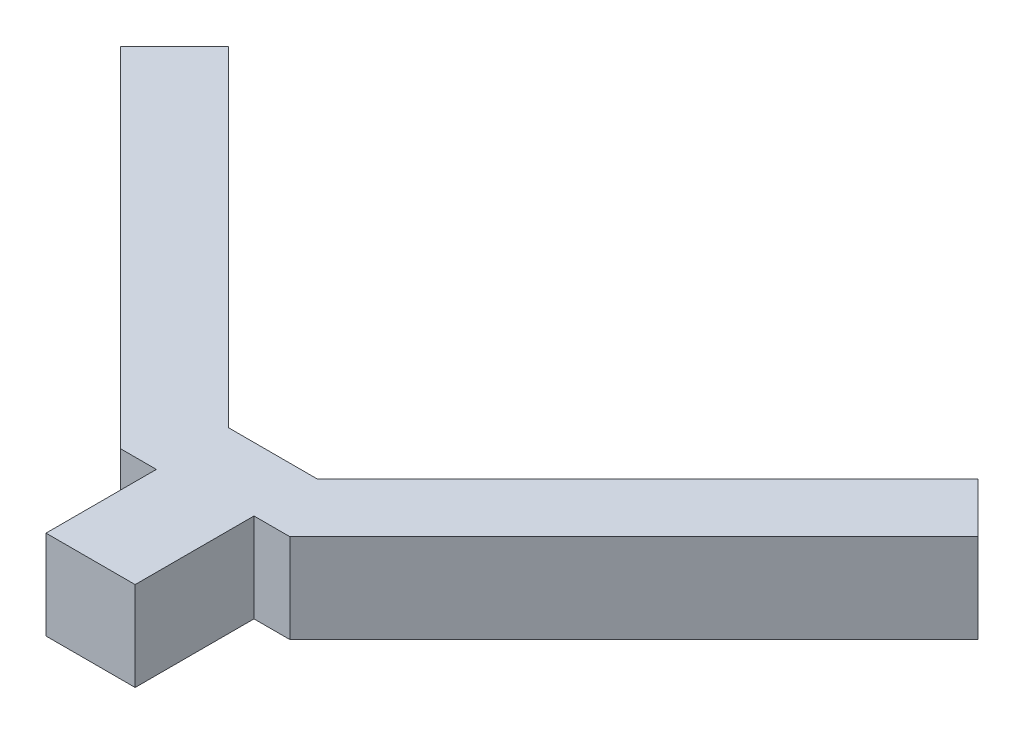
ISO-10303-21;
HEADER;
FILE_DESCRIPTION(('STEP AP214'),'2;1');
FILE_NAME('part.step','',(''),(''),'','','');
FILE_SCHEMA(('AUTOMOTIVE_DESIGN { 1 0 10303 214 1 1 1 1 }'));
ENDSEC;
DATA;
#1=APPLICATION_CONTEXT('core data for automotive mechanical design processes');
#2=APPLICATION_PROTOCOL_DEFINITION('international standard','automotive_design',2000,#1);
#3=PRODUCT_CONTEXT('',#1,'mechanical');
#4=PRODUCT('Part','Part','',(#3));
#5=PRODUCT_RELATED_PRODUCT_CATEGORY('part','',(#4));
#6=PRODUCT_DEFINITION_FORMATION('','',#4);
#7=PRODUCT_DEFINITION_CONTEXT('part definition',#1,'design');
#8=PRODUCT_DEFINITION('design','',#6,#7);
#9=PRODUCT_DEFINITION_SHAPE('','',#8);
#10=(LENGTH_UNIT() NAMED_UNIT(*) SI_UNIT(.MILLI.,.METRE.));
#11=(NAMED_UNIT(*) PLANE_ANGLE_UNIT() SI_UNIT($,.RADIAN.));
#12=(NAMED_UNIT(*) SI_UNIT($,.STERADIAN.) SOLID_ANGLE_UNIT());
#13=UNCERTAINTY_MEASURE_WITH_UNIT(LENGTH_MEASURE(1.E-05),#10,'distance_accuracy_value','');
#14=(GEOMETRIC_REPRESENTATION_CONTEXT(3) GLOBAL_UNCERTAINTY_ASSIGNED_CONTEXT((#13)) GLOBAL_UNIT_ASSIGNED_CONTEXT((#10,
#11,#12)) REPRESENTATION_CONTEXT('',''));
#15=CARTESIAN_POINT('',(0.,0.,0.));
#16=DIRECTION('',(0.,0.,1.));
#17=DIRECTION('',(1.,0.,0.));
#18=AXIS2_PLACEMENT_3D('',#15,#16,#17);
#19=CARTESIAN_POINT('',(-2.51008165496931,2.1,-1.17683209845663));
#20=DIRECTION('',(0.,0.,-1.));
#21=DIRECTION('',(-1.,0.,0.));
#22=AXIS2_PLACEMENT_3D('',#19,#20,#21);
#23=PLANE('',#22);
#24=DIRECTION('',(1.,0.,0.));
#25=VECTOR('',#24,1.);
#26=CARTESIAN_POINT('',(-2.51008165496931,0.,-1.17683209845663));
#27=LINE('',#26,#25);
#28=CARTESIAN_POINT('',(-2.51008165496931,0.,-1.17683209845663));
#29=VERTEX_POINT('',#28);
#30=CARTESIAN_POINT('',(-1.66449724267464,0.,-1.17683209845663));
#31=VERTEX_POINT('',#30);
#32=EDGE_CURVE('E155',#29,#31,#27,.T.);
#33=ORIENTED_EDGE('',*,*,#32,.T.);
#34=DIRECTION('',(0.,-1.,0.));
#35=VECTOR('',#34,1.);
#36=CARTESIAN_POINT('',(-1.66449724267464,2.1,-1.17683209845663));
#37=LINE('',#36,#35);
#38=CARTESIAN_POINT('',(-1.66449724267464,2.1,-1.17683209845663));
#39=VERTEX_POINT('',#38);
#40=EDGE_CURVE('E11',#39,#31,#37,.T.);
#41=ORIENTED_EDGE('',*,*,#40,.F.);
#42=DIRECTION('',(1.,0.,0.));
#43=VECTOR('',#42,1.);
#44=CARTESIAN_POINT('',(-2.51008165496931,2.1,-1.17683209845663));
#45=LINE('',#44,#43);
#46=CARTESIAN_POINT('',(-2.51008165496931,2.1,-1.17683209845663));
#47=VERTEX_POINT('',#46);
#48=EDGE_CURVE('E177',#47,#39,#45,.T.);
#49=ORIENTED_EDGE('',*,*,#48,.F.);
#50=DIRECTION('',(0.,-1.,0.));
#51=VECTOR('',#50,1.);
#52=CARTESIAN_POINT('',(-2.51008165496931,2.1,-1.17683209845663));
#53=LINE('',#52,#51);
#54=EDGE_CURVE('E151',#47,#29,#53,.T.);
#55=ORIENTED_EDGE('',*,*,#54,.T.);
#56=EDGE_LOOP('',(#33,#41,#49,#55));
#57=FACE_BOUND('',#56,.T.);
#58=ADVANCED_FACE('F35',(#57),#23,.F.);
#59=CARTESIAN_POINT('',(-1.66449724267464,2.1,-1.17683209845663));
#60=DIRECTION('',(1.,0.,0.));
#61=DIRECTION('',(0.,0.,-1.));
#62=AXIS2_PLACEMENT_3D('',#59,#60,#61);
#63=PLANE('',#62);
#64=DIRECTION('',(0.,0.,1.));
#65=VECTOR('',#64,1.);
#66=CARTESIAN_POINT('',(-1.66449724267464,0.,-1.17683209845663));
#67=LINE('',#66,#65);
#68=CARTESIAN_POINT('',(-1.66449724267464,0.,1.42316790154337));
#69=VERTEX_POINT('',#68);
#70=EDGE_CURVE('E158',#31,#69,#67,.T.);
#71=ORIENTED_EDGE('',*,*,#70,.T.);
#72=DIRECTION('',(0.,-1.,0.));
#73=VECTOR('',#72,1.);
#74=CARTESIAN_POINT('',(-1.66449724267464,2.1,1.42316790154337));
#75=LINE('',#74,#73);
#76=CARTESIAN_POINT('',(-1.66449724267464,2.1,1.42316790154337));
#77=VERTEX_POINT('',#76);
#78=EDGE_CURVE('E43',#77,#69,#75,.T.);
#79=ORIENTED_EDGE('',*,*,#78,.F.);
#80=DIRECTION('',(0.,0.,1.));
#81=VECTOR('',#80,1.);
#82=CARTESIAN_POINT('',(-1.66449724267464,2.1,-1.17683209845663));
#83=LINE('',#82,#81);
#84=EDGE_CURVE('E106',#39,#77,#83,.T.);
#85=ORIENTED_EDGE('',*,*,#84,.F.);
#86=ORIENTED_EDGE('',*,*,#40,.T.);
#87=EDGE_LOOP('',(#71,#79,#85,#86));
#88=FACE_BOUND('',#87,.T.);
#89=ADVANCED_FACE('F255',(#88),#63,.F.);
#90=CARTESIAN_POINT('',(-1.66449724267464,2.1,1.42316790154337));
#91=DIRECTION('',(0.,0.,-1.));
#92=DIRECTION('',(-1.,0.,0.));
#93=AXIS2_PLACEMENT_3D('',#90,#91,#92);
#94=PLANE('',#93);
#95=DIRECTION('',(1.,0.,0.));
#96=VECTOR('',#95,1.);
#97=CARTESIAN_POINT('',(-1.66449724267464,0.,1.42316790154337));
#98=LINE('',#97,#96);
#99=CARTESIAN_POINT('',(0.43550275732536,0.,1.42316790154337));
#100=VERTEX_POINT('',#99);
#101=EDGE_CURVE('E160',#69,#100,#98,.T.);
#102=ORIENTED_EDGE('',*,*,#101,.T.);
#103=DIRECTION('',(0.,-1.,0.));
#104=VECTOR('',#103,1.);
#105=CARTESIAN_POINT('',(0.43550275732536,2.1,1.42316790154337));
#106=LINE('',#105,#104);
#107=CARTESIAN_POINT('',(0.43550275732536,2.1,1.42316790154337));
#108=VERTEX_POINT('',#107);
#109=EDGE_CURVE('E196',#108,#100,#106,.T.);
#110=ORIENTED_EDGE('',*,*,#109,.F.);
#111=DIRECTION('',(1.,0.,0.));
#112=VECTOR('',#111,1.);
#113=CARTESIAN_POINT('',(-1.66449724267464,2.1,1.42316790154337));
#114=LINE('',#113,#112);
#115=EDGE_CURVE('E204',#77,#108,#114,.T.);
#116=ORIENTED_EDGE('',*,*,#115,.F.);
#117=ORIENTED_EDGE('',*,*,#78,.T.);
#118=EDGE_LOOP('',(#102,#110,#116,#117));
#119=FACE_BOUND('',#118,.T.);
#120=ADVANCED_FACE('F202',(#119),#94,.F.);
#121=CARTESIAN_POINT('',(0.43550275732536,2.1,-1.37683209845663));
#122=DIRECTION('',(-1.,0.,0.));
#123=DIRECTION('',(0.,0.,1.));
#124=AXIS2_PLACEMENT_3D('',#121,#122,#123);
#125=PLANE('',#124);
#126=DIRECTION('',(0.,0.,-1.));
#127=VECTOR('',#126,1.);
#128=CARTESIAN_POINT('',(0.43550275732536,0.,-1.37683209845663));
#129=LINE('',#128,#127);
#130=CARTESIAN_POINT('',(0.43550275732536,0.,-1.37683209845663));
#131=VERTEX_POINT('',#130);
#132=EDGE_CURVE('E162',#100,#131,#129,.T.);
#133=ORIENTED_EDGE('',*,*,#132,.T.);
#134=DIRECTION('',(0.,-1.,0.));
#135=VECTOR('',#134,1.);
#136=CARTESIAN_POINT('',(0.43550275732536,2.1,-1.37683209845663));
#137=LINE('',#136,#135);
#138=CARTESIAN_POINT('',(0.43550275732536,2.1,-1.37683209845663));
#139=VERTEX_POINT('',#138);
#140=EDGE_CURVE('E193',#139,#131,#137,.T.);
#141=ORIENTED_EDGE('',*,*,#140,.F.);
#142=DIRECTION('',(0.,0.,-1.));
#143=VECTOR('',#142,1.);
#144=CARTESIAN_POINT('',(0.43550275732536,2.1,-1.37683209845663));
#145=LINE('',#144,#143);
#146=EDGE_CURVE('E222',#108,#139,#145,.T.);
#147=ORIENTED_EDGE('',*,*,#146,.F.);
#148=ORIENTED_EDGE('',*,*,#109,.T.);
#149=EDGE_LOOP('',(#133,#141,#147,#148));
#150=FACE_BOUND('',#149,.T.);
#151=ADVANCED_FACE('F213',(#150),#125,.F.);
#152=CARTESIAN_POINT('',(1.28108716959006,2.1,-1.37683209845663));
#153=DIRECTION('',(0.,0.,-1.));
#154=DIRECTION('',(-1.,0.,0.));
#155=AXIS2_PLACEMENT_3D('',#152,#153,#154);
#156=PLANE('',#155);
#157=DIRECTION('',(1.,0.,0.));
#158=VECTOR('',#157,1.);
#159=CARTESIAN_POINT('',(1.28108716959006,0.,-1.37683209845663));
#160=LINE('',#159,#158);
#161=CARTESIAN_POINT('',(1.28108716959006,0.,-1.37683209845663));
#162=VERTEX_POINT('',#161);
#163=EDGE_CURVE('E164',#131,#162,#160,.T.);
#164=ORIENTED_EDGE('',*,*,#163,.T.);
#165=DIRECTION('',(0.,-1.,0.));
#166=VECTOR('',#165,1.);
#167=CARTESIAN_POINT('',(1.28108716959006,2.1,-1.37683209845663));
#168=LINE('',#167,#166);
#169=CARTESIAN_POINT('',(1.28108716959006,2.1,-1.37683209845663));
#170=VERTEX_POINT('',#169);
#171=EDGE_CURVE('E190',#170,#162,#168,.T.);
#172=ORIENTED_EDGE('',*,*,#171,.F.);
#173=DIRECTION('',(1.,0.,0.));
#174=VECTOR('',#173,1.);
#175=CARTESIAN_POINT('',(1.28108716959006,2.1,-1.37683209845663));
#176=LINE('',#175,#174);
#177=EDGE_CURVE('E219',#139,#170,#176,.T.);
#178=ORIENTED_EDGE('',*,*,#177,.F.);
#179=ORIENTED_EDGE('',*,*,#140,.T.);
#180=EDGE_LOOP('',(#164,#172,#178,#179));
#181=FACE_BOUND('',#180,.T.);
#182=ADVANCED_FACE('F217',(#181),#156,.F.);
#183=CARTESIAN_POINT('',(9.38646955649818,2.1,-9.48221448536475));
#184=DIRECTION('',(-0.707106781186548,0.,-0.707106781186548));
#185=DIRECTION('',(-0.707106781186548,0.,0.707106781186548));
#186=AXIS2_PLACEMENT_3D('',#183,#184,#185);
#187=PLANE('',#186);
#188=DIRECTION('',(0.707106781186547,0.,-0.707106781186547));
#189=VECTOR('',#188,1.);
#190=CARTESIAN_POINT('',(9.38646955649818,0.,-9.48221448536475));
#191=LINE('',#190,#189);
#192=CARTESIAN_POINT('',(9.38646955649818,0.,-9.48221448536475));
#193=VERTEX_POINT('',#192);
#194=EDGE_CURVE('E166',#162,#193,#191,.T.);
#195=ORIENTED_EDGE('',*,*,#194,.T.);
#196=DIRECTION('',(0.,-1.,0.));
#197=VECTOR('',#196,1.);
#198=CARTESIAN_POINT('',(9.38646955649818,2.1,-9.48221448536475));
#199=LINE('',#198,#197);
#200=CARTESIAN_POINT('',(9.38646955649818,2.1,-9.48221448536475));
#201=VERTEX_POINT('',#200);
#202=EDGE_CURVE('E187',#201,#193,#199,.T.);
#203=ORIENTED_EDGE('',*,*,#202,.F.);
#204=DIRECTION('',(0.707106781186547,0.,-0.707106781186547));
#205=VECTOR('',#204,1.);
#206=CARTESIAN_POINT('',(9.38646955649818,2.1,-9.48221448536475));
#207=LINE('',#206,#205);
#208=EDGE_CURVE('E221',#170,#201,#207,.T.);
#209=ORIENTED_EDGE('',*,*,#208,.F.);
#210=ORIENTED_EDGE('',*,*,#171,.T.);
#211=EDGE_LOOP('',(#195,#203,#209,#210));
#212=FACE_BOUND('',#211,.T.);
#213=ADVANCED_FACE('F268',(#212),#187,.F.);
#214=CARTESIAN_POINT('',(8.2136773503701,2.1,-10.6550066914928));
#215=DIRECTION('',(-0.707106781186548,0.,0.707106781186548));
#216=DIRECTION('',(0.707106781186548,0.,0.707106781186548));
#217=AXIS2_PLACEMENT_3D('',#214,#215,#216);
#218=PLANE('',#217);
#219=DIRECTION('',(-0.707106781186547,0.,-0.707106781186547));
#220=VECTOR('',#219,1.);
#221=CARTESIAN_POINT('',(8.2136773503701,0.,-10.6550066914928));
#222=LINE('',#221,#220);
#223=CARTESIAN_POINT('',(8.2136773503701,0.,-10.6550066914928));
#224=VERTEX_POINT('',#223);
#225=EDGE_CURVE('E168',#193,#224,#222,.T.);
#226=ORIENTED_EDGE('',*,*,#225,.T.);
#227=DIRECTION('',(0.,-1.,0.));
#228=VECTOR('',#227,1.);
#229=CARTESIAN_POINT('',(8.2136773503701,2.1,-10.6550066914928));
#230=LINE('',#229,#228);
#231=CARTESIAN_POINT('',(8.2136773503701,2.1,-10.6550066914928));
#232=VERTEX_POINT('',#231);
#233=EDGE_CURVE('E184',#232,#224,#230,.T.);
#234=ORIENTED_EDGE('',*,*,#233,.F.);
#235=DIRECTION('',(-0.707106781186547,0.,-0.707106781186547));
#236=VECTOR('',#235,1.);
#237=CARTESIAN_POINT('',(8.2136773503701,2.1,-10.6550066914928));
#238=LINE('',#237,#236);
#239=EDGE_CURVE('E224',#201,#232,#238,.T.);
#240=ORIENTED_EDGE('',*,*,#239,.F.);
#241=ORIENTED_EDGE('',*,*,#202,.T.);
#242=EDGE_LOOP('',(#226,#234,#240,#241));
#243=FACE_BOUND('',#242,.T.);
#244=ADVANCED_FACE('F271',(#243),#218,.F.);
#245=CARTESIAN_POINT('',(0.435502757318084,2.1,-2.8768320984408));
#246=DIRECTION('',(0.707106781186548,0.,0.707106781186547));
#247=DIRECTION('',(0.707106781186547,0.,-0.707106781186548));
#248=AXIS2_PLACEMENT_3D('',#245,#246,#247);
#249=PLANE('',#248);
#250=DIRECTION('',(-0.707106781186547,0.,0.707106781186548));
#251=VECTOR('',#250,1.);
#252=CARTESIAN_POINT('',(0.435502757318084,0.,-2.8768320984408));
#253=LINE('',#252,#251);
#254=CARTESIAN_POINT('',(0.435502757318084,0.,-2.8768320984408));
#255=VERTEX_POINT('',#254);
#256=EDGE_CURVE('E170',#224,#255,#253,.T.);
#257=ORIENTED_EDGE('',*,*,#256,.T.);
#258=DIRECTION('',(0.,-1.,0.));
#259=VECTOR('',#258,1.);
#260=CARTESIAN_POINT('',(0.435502757318084,2.1,-2.8768320984408));
#261=LINE('',#260,#259);
#262=CARTESIAN_POINT('',(0.435502757318084,2.1,-2.8768320984408));
#263=VERTEX_POINT('',#262);
#264=EDGE_CURVE('E181',#263,#255,#261,.T.);
#265=ORIENTED_EDGE('',*,*,#264,.F.);
#266=DIRECTION('',(-0.707106781186547,0.,0.707106781186548));
#267=VECTOR('',#266,1.);
#268=CARTESIAN_POINT('',(0.435502757318084,2.1,-2.8768320984408));
#269=LINE('',#268,#267);
#270=EDGE_CURVE('E230',#232,#263,#269,.T.);
#271=ORIENTED_EDGE('',*,*,#270,.F.);
#272=ORIENTED_EDGE('',*,*,#233,.T.);
#273=EDGE_LOOP('',(#257,#265,#271,#272));
#274=FACE_BOUND('',#273,.T.);
#275=ADVANCED_FACE('F236',(#274),#249,.F.);
#276=CARTESIAN_POINT('',(-1.66449724268192,2.1,-2.8768320984408));
#277=DIRECTION('',(0.,0.,1.));
#278=DIRECTION('',(1.,0.,0.));
#279=AXIS2_PLACEMENT_3D('',#276,#277,#278);
#280=PLANE('',#279);
#281=DIRECTION('',(-1.,0.,0.));
#282=VECTOR('',#281,1.);
#283=CARTESIAN_POINT('',(-1.66449724268192,0.,-2.8768320984408));
#284=LINE('',#283,#282);
#285=CARTESIAN_POINT('',(-1.66449724268192,0.,-2.8768320984408));
#286=VERTEX_POINT('',#285);
#287=EDGE_CURVE('E172',#255,#286,#284,.T.);
#288=ORIENTED_EDGE('',*,*,#287,.T.);
#289=DIRECTION('',(0.,-1.,0.));
#290=VECTOR('',#289,1.);
#291=CARTESIAN_POINT('',(-1.66449724268192,2.1,-2.8768320984408));
#292=LINE('',#291,#290);
#293=CARTESIAN_POINT('',(-1.66449724268192,2.1,-2.8768320984408));
#294=VERTEX_POINT('',#293);
#295=EDGE_CURVE('E146',#294,#286,#292,.T.);
#296=ORIENTED_EDGE('',*,*,#295,.F.);
#297=DIRECTION('',(-1.,0.,0.));
#298=VECTOR('',#297,1.);
#299=CARTESIAN_POINT('',(-1.66449724268192,2.1,-2.8768320984408));
#300=LINE('',#299,#298);
#301=EDGE_CURVE('E137',#263,#294,#300,.T.);
#302=ORIENTED_EDGE('',*,*,#301,.F.);
#303=ORIENTED_EDGE('',*,*,#264,.T.);
#304=EDGE_LOOP('',(#288,#296,#302,#303));
#305=FACE_BOUND('',#304,.T.);
#306=ADVANCED_FACE('F240',(#305),#280,.F.);
#307=CARTESIAN_POINT('',(-1.66449724268192,2.1,-2.8768320984408));
#308=DIRECTION('',(-0.707106781186548,0.,0.707106781186548));
#309=DIRECTION('',(0.707106781186548,0.,0.707106781186548));
#310=AXIS2_PLACEMENT_3D('',#307,#308,#309);
#311=PLANE('',#310);
#312=DIRECTION('',(-0.707106781186548,0.,-0.707106781186548));
#313=VECTOR('',#312,1.);
#314=CARTESIAN_POINT('',(-1.66449724268192,0.,-2.8768320984408));
#315=LINE('',#314,#313);
#316=CARTESIAN_POINT('',(-9.44267183573394,0.,-10.6550066914928));
#317=VERTEX_POINT('',#316);
#318=EDGE_CURVE('E145',#286,#317,#315,.T.);
#319=ORIENTED_EDGE('',*,*,#318,.T.);
#320=DIRECTION('',(0.,-1.,0.));
#321=VECTOR('',#320,1.);
#322=CARTESIAN_POINT('',(-9.44267183573394,2.1,-10.6550066914928));
#323=LINE('',#322,#321);
#324=CARTESIAN_POINT('',(-9.44267183573394,2.1,-10.6550066914928));
#325=VERTEX_POINT('',#324);
#326=EDGE_CURVE('E142',#325,#317,#323,.T.);
#327=ORIENTED_EDGE('',*,*,#326,.F.);
#328=DIRECTION('',(-0.707106781186548,0.,-0.707106781186548));
#329=VECTOR('',#328,1.);
#330=CARTESIAN_POINT('',(-1.66449724268192,2.1,-2.8768320984408));
#331=LINE('',#330,#329);
#332=EDGE_CURVE('E131',#294,#325,#331,.T.);
#333=ORIENTED_EDGE('',*,*,#332,.F.);
#334=ORIENTED_EDGE('',*,*,#295,.T.);
#335=EDGE_LOOP('',(#319,#327,#333,#334));
#336=FACE_BOUND('',#335,.T.);
#337=ADVANCED_FACE('F143',(#336),#311,.F.);
#338=CARTESIAN_POINT('',(-9.44267183573394,2.1,-10.6550066914928));
#339=DIRECTION('',(0.707106781186547,0.,0.707106781186548));
#340=DIRECTION('',(0.707106781186548,0.,-0.707106781186547));
#341=AXIS2_PLACEMENT_3D('',#338,#339,#340);
#342=PLANE('',#341);
#343=DIRECTION('',(-0.707106781186548,0.,0.707106781186547));
#344=VECTOR('',#343,1.);
#345=CARTESIAN_POINT('',(-9.44267183573394,0.,-10.6550066914928));
#346=LINE('',#345,#344);
#347=CARTESIAN_POINT('',(-10.7154640418697,0.,-9.38221448535704));
#348=VERTEX_POINT('',#347);
#349=EDGE_CURVE('E92',#317,#348,#346,.T.);
#350=ORIENTED_EDGE('',*,*,#349,.T.);
#351=DIRECTION('',(0.,-1.,0.));
#352=VECTOR('',#351,1.);
#353=CARTESIAN_POINT('',(-10.7154640418697,2.1,-9.38221448535704));
#354=LINE('',#353,#352);
#355=CARTESIAN_POINT('',(-10.7154640418697,2.1,-9.38221448535704));
#356=VERTEX_POINT('',#355);
#357=EDGE_CURVE('E147',#356,#348,#354,.T.);
#358=ORIENTED_EDGE('',*,*,#357,.F.);
#359=DIRECTION('',(-0.707106781186548,0.,0.707106781186547));
#360=VECTOR('',#359,1.);
#361=CARTESIAN_POINT('',(-9.44267183573394,2.1,-10.6550066914928));
#362=LINE('',#361,#360);
#363=EDGE_CURVE('E135',#325,#356,#362,.T.);
#364=ORIENTED_EDGE('',*,*,#363,.F.);
#365=ORIENTED_EDGE('',*,*,#326,.T.);
#366=EDGE_LOOP('',(#350,#358,#364,#365));
#367=FACE_BOUND('',#366,.T.);
#368=ADVANCED_FACE('F149',(#367),#342,.F.);
#369=CARTESIAN_POINT('',(-10.7154640418697,2.1,-9.38221448535704));
#370=DIRECTION('',(0.707106781186548,0.,-0.707106781186548));
#371=DIRECTION('',(-0.707106781186548,0.,-0.707106781186548));
#372=AXIS2_PLACEMENT_3D('',#369,#370,#371);
#373=PLANE('',#372);
#374=DIRECTION('',(0.707106781186548,0.,0.707106781186548));
#375=VECTOR('',#374,1.);
#376=CARTESIAN_POINT('',(-10.7154640418697,0.,-9.38221448535704));
#377=LINE('',#376,#375);
#378=EDGE_CURVE('E98',#348,#29,#377,.T.);
#379=ORIENTED_EDGE('',*,*,#378,.T.);
#380=ORIENTED_EDGE('',*,*,#54,.F.);
#381=DIRECTION('',(0.707106781186548,0.,0.707106781186548));
#382=VECTOR('',#381,1.);
#383=CARTESIAN_POINT('',(-10.7154640418697,2.1,-9.38221448535704));
#384=LINE('',#383,#382);
#385=EDGE_CURVE('E51',#356,#47,#384,.T.);
#386=ORIENTED_EDGE('',*,*,#385,.F.);
#387=ORIENTED_EDGE('',*,*,#357,.T.);
#388=EDGE_LOOP('',(#379,#380,#386,#387));
#389=FACE_BOUND('',#388,.T.);
#390=ADVANCED_FACE('F244',(#389),#373,.F.);
#391=CARTESIAN_POINT('',(0.,2.1,0.));
#392=DIRECTION('',(0.,-1.,0.));
#393=DIRECTION('',(0.,0.,-1.));
#394=AXIS2_PLACEMENT_3D('',#391,#392,#393);
#395=PLANE('',#394);
#396=ORIENTED_EDGE('',*,*,#48,.T.);
#397=ORIENTED_EDGE('',*,*,#84,.T.);
#398=ORIENTED_EDGE('',*,*,#115,.T.);
#399=ORIENTED_EDGE('',*,*,#146,.T.);
#400=ORIENTED_EDGE('',*,*,#177,.T.);
#401=ORIENTED_EDGE('',*,*,#208,.T.);
#402=ORIENTED_EDGE('',*,*,#239,.T.);
#403=ORIENTED_EDGE('',*,*,#270,.T.);
#404=ORIENTED_EDGE('',*,*,#301,.T.);
#405=ORIENTED_EDGE('',*,*,#332,.T.);
#406=ORIENTED_EDGE('',*,*,#363,.T.);
#407=ORIENTED_EDGE('',*,*,#385,.T.);
#408=EDGE_LOOP('',(#396,#397,#398,#399,#400,#401,#402,#403,#404,#405,#406,#407));
#409=FACE_BOUND('',#408,.T.);
#410=ADVANCED_FACE('F133',(#409),#395,.F.);
#411=CARTESIAN_POINT('',(0.,0.,0.));
#412=DIRECTION('',(0.,-1.,0.));
#413=DIRECTION('',(0.,0.,-1.));
#414=AXIS2_PLACEMENT_3D('',#411,#412,#413);
#415=PLANE('',#414);
#416=ORIENTED_EDGE('',*,*,#32,.F.);
#417=ORIENTED_EDGE('',*,*,#378,.F.);
#418=ORIENTED_EDGE('',*,*,#349,.F.);
#419=ORIENTED_EDGE('',*,*,#318,.F.);
#420=ORIENTED_EDGE('',*,*,#287,.F.);
#421=ORIENTED_EDGE('',*,*,#256,.F.);
#422=ORIENTED_EDGE('',*,*,#225,.F.);
#423=ORIENTED_EDGE('',*,*,#194,.F.);
#424=ORIENTED_EDGE('',*,*,#163,.F.);
#425=ORIENTED_EDGE('',*,*,#132,.F.);
#426=ORIENTED_EDGE('',*,*,#101,.F.);
#427=ORIENTED_EDGE('',*,*,#70,.F.);
#428=EDGE_LOOP('',(#416,#417,#418,#419,#420,#421,#422,#423,#424,#425,#426,#427));
#429=FACE_BOUND('',#428,.T.);
#430=ADVANCED_FACE('F208',(#429),#415,.T.);
#431=CLOSED_SHELL('',(#58,#89,#120,#151,#182,#213,#244,#275,#306,#337,#368,#390,#410,#430));
#432=MANIFOLD_SOLID_BREP('B2',#431);
#433=ADVANCED_BREP_SHAPE_REPRESENTATION('',(#18,#432),#14);
#434=SHAPE_DEFINITION_REPRESENTATION(#9,#433);
ENDSEC;
END-ISO-10303-21;
